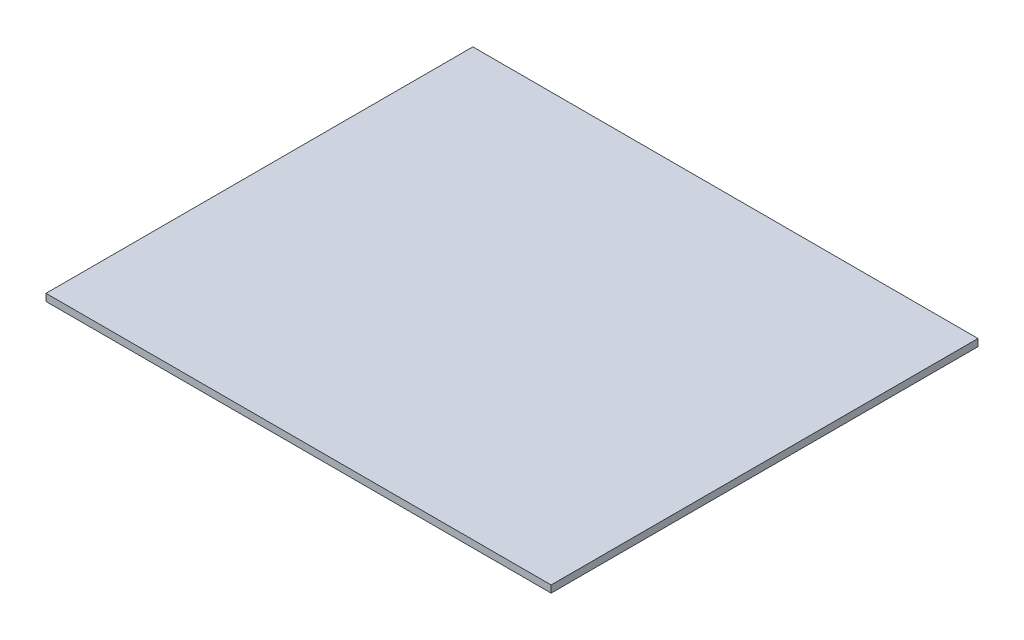
ISO-10303-21;
HEADER;
FILE_DESCRIPTION(('STEP AP214'),'2;1');
FILE_NAME('part.step','',(''),(''),'','','');
FILE_SCHEMA(('AUTOMOTIVE_DESIGN { 1 0 10303 214 1 1 1 1 }'));
ENDSEC;
DATA;
#1=APPLICATION_CONTEXT('core data for automotive mechanical design processes');
#2=APPLICATION_PROTOCOL_DEFINITION('international standard','automotive_design',2000,#1);
#3=PRODUCT_CONTEXT('',#1,'mechanical');
#4=PRODUCT('Part','Part','',(#3));
#5=PRODUCT_RELATED_PRODUCT_CATEGORY('part','',(#4));
#6=PRODUCT_DEFINITION_FORMATION('','',#4);
#7=PRODUCT_DEFINITION_CONTEXT('part definition',#1,'design');
#8=PRODUCT_DEFINITION('design','',#6,#7);
#9=PRODUCT_DEFINITION_SHAPE('','',#8);
#10=(LENGTH_UNIT() NAMED_UNIT(*) SI_UNIT(.MILLI.,.METRE.));
#11=(NAMED_UNIT(*) PLANE_ANGLE_UNIT() SI_UNIT($,.RADIAN.));
#12=(NAMED_UNIT(*) SI_UNIT($,.STERADIAN.) SOLID_ANGLE_UNIT());
#13=UNCERTAINTY_MEASURE_WITH_UNIT(LENGTH_MEASURE(1.E-05),#10,'distance_accuracy_value','');
#14=(GEOMETRIC_REPRESENTATION_CONTEXT(3) GLOBAL_UNCERTAINTY_ASSIGNED_CONTEXT((#13)) GLOBAL_UNIT_ASSIGNED_CONTEXT((#10,
#11,#12)) REPRESENTATION_CONTEXT('',''));
#15=CARTESIAN_POINT('',(0.,0.,0.));
#16=DIRECTION('',(0.,0.,1.));
#17=DIRECTION('',(1.,0.,0.));
#18=AXIS2_PLACEMENT_3D('',#15,#16,#17);
#19=CARTESIAN_POINT('',(0.,6.35,0.));
#20=DIRECTION('',(0.,-1.,0.));
#21=DIRECTION('',(0.,0.,-1.));
#22=AXIS2_PLACEMENT_3D('',#19,#20,#21);
#23=PLANE('',#22);
#24=DIRECTION('',(1.,0.,0.));
#25=VECTOR('',#24,1.);
#26=CARTESIAN_POINT('',(0.,6.35,0.));
#27=LINE('',#26,#25);
#28=CARTESIAN_POINT('',(0.,6.35,0.));
#29=VERTEX_POINT('',#28);
#30=CARTESIAN_POINT('',(450.85,6.35,0.));
#31=VERTEX_POINT('',#30);
#32=EDGE_CURVE('E60',#29,#31,#27,.T.);
#33=ORIENTED_EDGE('',*,*,#32,.T.);
#34=DIRECTION('',(0.,0.,1.));
#35=VECTOR('',#34,1.);
#36=CARTESIAN_POINT('',(450.85,6.35,-381.));
#37=LINE('',#36,#35);
#38=CARTESIAN_POINT('',(450.85,6.35,-381.));
#39=VERTEX_POINT('',#38);
#40=EDGE_CURVE('E100',#39,#31,#37,.T.);
#41=ORIENTED_EDGE('',*,*,#40,.F.);
#42=DIRECTION('',(1.,0.,0.));
#43=VECTOR('',#42,1.);
#44=CARTESIAN_POINT('',(0.,6.35,-381.));
#45=LINE('',#44,#43);
#46=CARTESIAN_POINT('',(0.,6.35,-381.));
#47=VERTEX_POINT('',#46);
#48=EDGE_CURVE('E112',#47,#39,#45,.T.);
#49=ORIENTED_EDGE('',*,*,#48,.F.);
#50=DIRECTION('',(0.,0.,1.));
#51=VECTOR('',#50,1.);
#52=CARTESIAN_POINT('',(0.,6.35,0.));
#53=LINE('',#52,#51);
#54=EDGE_CURVE('E76',#47,#29,#53,.T.);
#55=ORIENTED_EDGE('',*,*,#54,.T.);
#56=EDGE_LOOP('',(#33,#41,#49,#55));
#57=FACE_BOUND('',#56,.T.);
#58=ADVANCED_FACE('F51',(#57),#23,.F.);
#59=CARTESIAN_POINT('',(0.,0.,0.));
#60=DIRECTION('',(0.,-1.,0.));
#61=DIRECTION('',(0.,0.,-1.));
#62=AXIS2_PLACEMENT_3D('',#59,#60,#61);
#63=PLANE('',#62);
#64=DIRECTION('',(0.,0.,1.));
#65=VECTOR('',#64,1.);
#66=CARTESIAN_POINT('',(450.85,0.,-381.));
#67=LINE('',#66,#65);
#68=CARTESIAN_POINT('',(450.85,0.,-381.));
#69=VERTEX_POINT('',#68);
#70=CARTESIAN_POINT('',(450.85,0.,0.));
#71=VERTEX_POINT('',#70);
#72=EDGE_CURVE('E97',#69,#71,#67,.T.);
#73=ORIENTED_EDGE('',*,*,#72,.T.);
#74=DIRECTION('',(1.,0.,0.));
#75=VECTOR('',#74,1.);
#76=CARTESIAN_POINT('',(0.,0.,0.));
#77=LINE('',#76,#75);
#78=CARTESIAN_POINT('',(0.,0.,0.));
#79=VERTEX_POINT('',#78);
#80=EDGE_CURVE('E110',#79,#71,#77,.T.);
#81=ORIENTED_EDGE('',*,*,#80,.F.);
#82=DIRECTION('',(0.,0.,1.));
#83=VECTOR('',#82,1.);
#84=CARTESIAN_POINT('',(0.,0.,0.));
#85=LINE('',#84,#83);
#86=CARTESIAN_POINT('',(0.,0.,-381.));
#87=VERTEX_POINT('',#86);
#88=EDGE_CURVE('E117',#87,#79,#85,.T.);
#89=ORIENTED_EDGE('',*,*,#88,.F.);
#90=DIRECTION('',(1.,0.,0.));
#91=VECTOR('',#90,1.);
#92=CARTESIAN_POINT('',(0.,0.,-381.));
#93=LINE('',#92,#91);
#94=EDGE_CURVE('E104',#87,#69,#93,.T.);
#95=ORIENTED_EDGE('',*,*,#94,.T.);
#96=EDGE_LOOP('',(#73,#81,#89,#95));
#97=FACE_BOUND('',#96,.T.);
#98=ADVANCED_FACE('F108',(#97),#63,.T.);
#99=CARTESIAN_POINT('',(0.,6.35,0.));
#100=DIRECTION('',(0.,0.,-1.));
#101=DIRECTION('',(-1.,0.,0.));
#102=AXIS2_PLACEMENT_3D('',#99,#100,#101);
#103=PLANE('',#102);
#104=ORIENTED_EDGE('',*,*,#80,.T.);
#105=DIRECTION('',(0.,1.,0.));
#106=VECTOR('',#105,1.);
#107=CARTESIAN_POINT('',(450.85,-0.00100000000000013,0.));
#108=LINE('',#107,#106);
#109=EDGE_CURVE('E94',#71,#31,#108,.T.);
#110=ORIENTED_EDGE('',*,*,#109,.T.);
#111=ORIENTED_EDGE('',*,*,#32,.F.);
#112=DIRECTION('',(0.,-1.,0.));
#113=VECTOR('',#112,1.);
#114=CARTESIAN_POINT('',(0.,6.35,0.));
#115=LINE('',#114,#113);
#116=EDGE_CURVE('E11',#29,#79,#115,.T.);
#117=ORIENTED_EDGE('',*,*,#116,.T.);
#118=EDGE_LOOP('',(#104,#110,#111,#117));
#119=FACE_BOUND('',#118,.T.);
#120=ADVANCED_FACE('F114',(#119),#103,.F.);
#121=CARTESIAN_POINT('',(0.,6.35,0.));
#122=DIRECTION('',(1.,0.,0.));
#123=DIRECTION('',(0.,0.,-1.));
#124=AXIS2_PLACEMENT_3D('',#121,#122,#123);
#125=PLANE('',#124);
#126=ORIENTED_EDGE('',*,*,#54,.F.);
#127=DIRECTION('',(0.,1.,0.));
#128=VECTOR('',#127,1.);
#129=CARTESIAN_POINT('',(0.,-0.00100000000000013,-381.));
#130=LINE('',#129,#128);
#131=EDGE_CURVE('E127',#87,#47,#130,.T.);
#132=ORIENTED_EDGE('',*,*,#131,.F.);
#133=ORIENTED_EDGE('',*,*,#88,.T.);
#134=ORIENTED_EDGE('',*,*,#116,.F.);
#135=EDGE_LOOP('',(#126,#132,#133,#134));
#136=FACE_BOUND('',#135,.T.);
#137=ADVANCED_FACE('F53',(#136),#125,.F.);
#138=CARTESIAN_POINT('',(0.,-0.00100000000000013,-381.));
#139=DIRECTION('',(0.,0.,1.));
#140=DIRECTION('',(1.,0.,0.));
#141=AXIS2_PLACEMENT_3D('',#138,#139,#140);
#142=PLANE('',#141);
#143=ORIENTED_EDGE('',*,*,#131,.T.);
#144=ORIENTED_EDGE('',*,*,#48,.T.);
#145=DIRECTION('',(0.,1.,0.));
#146=VECTOR('',#145,1.);
#147=CARTESIAN_POINT('',(450.85,-0.00100000000000013,-381.));
#148=LINE('',#147,#146);
#149=EDGE_CURVE('E67',#69,#39,#148,.T.);
#150=ORIENTED_EDGE('',*,*,#149,.F.);
#151=ORIENTED_EDGE('',*,*,#94,.F.);
#152=EDGE_LOOP('',(#143,#144,#150,#151));
#153=FACE_BOUND('',#152,.T.);
#154=ADVANCED_FACE('F135',(#153),#142,.F.);
#155=CARTESIAN_POINT('',(450.85,-0.00100000000000013,-381.));
#156=DIRECTION('',(-1.,0.,0.));
#157=DIRECTION('',(0.,0.,1.));
#158=AXIS2_PLACEMENT_3D('',#155,#156,#157);
#159=PLANE('',#158);
#160=ORIENTED_EDGE('',*,*,#149,.T.);
#161=ORIENTED_EDGE('',*,*,#40,.T.);
#162=ORIENTED_EDGE('',*,*,#109,.F.);
#163=ORIENTED_EDGE('',*,*,#72,.F.);
#164=EDGE_LOOP('',(#160,#161,#162,#163));
#165=FACE_BOUND('',#164,.T.);
#166=ADVANCED_FACE('F96',(#165),#159,.F.);
#167=CLOSED_SHELL('',(#58,#98,#120,#137,#154,#166));
#168=MANIFOLD_SOLID_BREP('B2',#167);
#169=ADVANCED_BREP_SHAPE_REPRESENTATION('',(#18,#168),#14);
#170=SHAPE_DEFINITION_REPRESENTATION(#9,#169);
ENDSEC;
END-ISO-10303-21;
